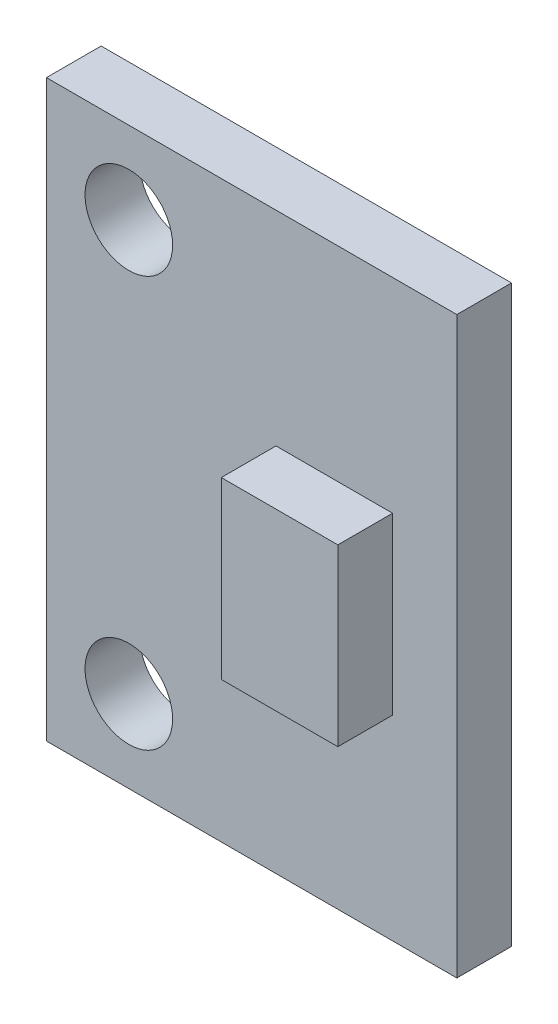
ISO-10303-21;
HEADER;
FILE_DESCRIPTION(('STEP AP214'),'2;1');
FILE_NAME('part.step','',(''),(''),'','','');
FILE_SCHEMA(('AUTOMOTIVE_DESIGN { 1 0 10303 214 1 1 1 1 }'));
ENDSEC;
DATA;
#1=APPLICATION_CONTEXT('core data for automotive mechanical design processes');
#2=APPLICATION_PROTOCOL_DEFINITION('international standard','automotive_design',2000,#1);
#3=PRODUCT_CONTEXT('',#1,'mechanical');
#4=PRODUCT('Part','Part','',(#3));
#5=PRODUCT_RELATED_PRODUCT_CATEGORY('part','',(#4));
#6=PRODUCT_DEFINITION_FORMATION('','',#4);
#7=PRODUCT_DEFINITION_CONTEXT('part definition',#1,'design');
#8=PRODUCT_DEFINITION('design','',#6,#7);
#9=PRODUCT_DEFINITION_SHAPE('','',#8);
#10=(LENGTH_UNIT() NAMED_UNIT(*) SI_UNIT(.MILLI.,.METRE.));
#11=(NAMED_UNIT(*) PLANE_ANGLE_UNIT() SI_UNIT($,.RADIAN.));
#12=(NAMED_UNIT(*) SI_UNIT($,.STERADIAN.) SOLID_ANGLE_UNIT());
#13=UNCERTAINTY_MEASURE_WITH_UNIT(LENGTH_MEASURE(1.E-05),#10,'distance_accuracy_value','');
#14=(GEOMETRIC_REPRESENTATION_CONTEXT(3) GLOBAL_UNCERTAINTY_ASSIGNED_CONTEXT((#13)) GLOBAL_UNIT_ASSIGNED_CONTEXT((#10,
#11,#12)) REPRESENTATION_CONTEXT('',''));
#15=CARTESIAN_POINT('',(0.,0.,0.));
#16=DIRECTION('',(0.,0.,1.));
#17=DIRECTION('',(1.,0.,0.));
#18=AXIS2_PLACEMENT_3D('',#15,#16,#17);
#19=CARTESIAN_POINT('',(0.,0.,2.));
#20=DIRECTION('',(0.,0.,1.));
#21=DIRECTION('',(1.,0.,0.));
#22=AXIS2_PLACEMENT_3D('',#19,#20,#21);
#23=PLANE('',#22);
#24=CARTESIAN_POINT('',(-81.438295893754,-171.388194030995,2.));
#25=DIRECTION('',(0.,0.,1.));
#26=DIRECTION('',(1.,0.,0.));
#27=AXIS2_PLACEMENT_3D('',#24,#25,#26);
#28=CIRCLE('',#27,1.6);
#29=CARTESIAN_POINT('',(-79.838295893754,-171.388194030995,2.));
#30=VERTEX_POINT('',#29);
#31=EDGE_CURVE('E147',#30,#30,#28,.T.);
#32=ORIENTED_EDGE('',*,*,#31,.F.);
#33=EDGE_LOOP('',(#32));
#34=FACE_BOUND('',#33,.T.);
#35=DIRECTION('',(0.,-1.,0.));
#36=VECTOR('',#35,1.);
#37=CARTESIAN_POINT('',(-84.4492861501245,-168.388194030995,2.));
#38=LINE('',#37,#36);
#39=CARTESIAN_POINT('',(-84.4492861501245,-168.388194030995,2.));
#40=VERTEX_POINT('',#39);
#41=CARTESIAN_POINT('',(-84.4492861501245,-189.388194030995,2.));
#42=VERTEX_POINT('',#41);
#43=EDGE_CURVE('E153',#40,#42,#38,.T.);
#44=ORIENTED_EDGE('',*,*,#43,.T.);
#45=DIRECTION('',(1.,0.,0.));
#46=VECTOR('',#45,1.);
#47=CARTESIAN_POINT('',(-84.4492861501245,-189.388194030995,2.));
#48=LINE('',#47,#46);
#49=CARTESIAN_POINT('',(-69.4492861501245,-189.388194030995,2.));
#50=VERTEX_POINT('',#49);
#51=EDGE_CURVE('E89',#42,#50,#48,.T.);
#52=ORIENTED_EDGE('',*,*,#51,.T.);
#53=DIRECTION('',(0.,1.,0.));
#54=VECTOR('',#53,1.);
#55=CARTESIAN_POINT('',(-69.4492861501245,-168.388194030995,2.));
#56=LINE('',#55,#54);
#57=CARTESIAN_POINT('',(-69.4492861501245,-168.388194030995,2.));
#58=VERTEX_POINT('',#57);
#59=EDGE_CURVE('E156',#50,#58,#56,.T.);
#60=ORIENTED_EDGE('',*,*,#59,.T.);
#61=DIRECTION('',(-1.,0.,0.));
#62=VECTOR('',#61,1.);
#63=CARTESIAN_POINT('',(-84.4492861501245,-168.388194030995,2.));
#64=LINE('',#63,#62);
#65=EDGE_CURVE('E61',#58,#40,#64,.T.);
#66=ORIENTED_EDGE('',*,*,#65,.T.);
#67=EDGE_LOOP('',(#44,#52,#60,#66));
#68=FACE_BOUND('',#67,.T.);
#69=CARTESIAN_POINT('',(-81.438295893754,-186.388194030995,2.));
#70=DIRECTION('',(0.,0.,1.));
#71=DIRECTION('',(1.,0.,0.));
#72=AXIS2_PLACEMENT_3D('',#69,#70,#71);
#73=CIRCLE('',#72,1.6);
#74=CARTESIAN_POINT('',(-79.838295893754,-186.388194030995,2.));
#75=VERTEX_POINT('',#74);
#76=EDGE_CURVE('E139',#75,#75,#73,.T.);
#77=ORIENTED_EDGE('',*,*,#76,.F.);
#78=EDGE_LOOP('',(#77));
#79=FACE_BOUND('',#78,.T.);
#80=DIRECTION('',(1.,0.,0.));
#81=VECTOR('',#80,1.);
#82=CARTESIAN_POINT('',(-76.0587653448197,-182.242282422918,2.));
#83=LINE('',#82,#81);
#84=CARTESIAN_POINT('',(-76.0587653448197,-182.242282422918,2.));
#85=VERTEX_POINT('',#84);
#86=CARTESIAN_POINT('',(-71.798583319056,-182.242282422918,2.));
#87=VERTEX_POINT('',#86);
#88=EDGE_CURVE('E302',#85,#87,#83,.T.);
#89=ORIENTED_EDGE('',*,*,#88,.F.);
#90=DIRECTION('',(0.,-1.,0.));
#91=VECTOR('',#90,1.);
#92=CARTESIAN_POINT('',(-76.0587653448197,-175.852009384272,2.));
#93=LINE('',#92,#91);
#94=CARTESIAN_POINT('',(-76.0587653448197,-175.852009384272,2.));
#95=VERTEX_POINT('',#94);
#96=EDGE_CURVE('E134',#95,#85,#93,.T.);
#97=ORIENTED_EDGE('',*,*,#96,.F.);
#98=DIRECTION('',(-1.,0.,0.));
#99=VECTOR('',#98,1.);
#100=CARTESIAN_POINT('',(-76.0587653448197,-175.852009384272,2.));
#101=LINE('',#100,#99);
#102=CARTESIAN_POINT('',(-71.798583319056,-175.852009384272,2.));
#103=VERTEX_POINT('',#102);
#104=EDGE_CURVE('E130',#103,#95,#101,.T.);
#105=ORIENTED_EDGE('',*,*,#104,.F.);
#106=DIRECTION('',(0.,1.,0.));
#107=VECTOR('',#106,1.);
#108=CARTESIAN_POINT('',(-71.798583319056,-175.852009384272,2.));
#109=LINE('',#108,#107);
#110=EDGE_CURVE('E299',#87,#103,#109,.T.);
#111=ORIENTED_EDGE('',*,*,#110,.F.);
#112=EDGE_LOOP('',(#89,#97,#105,#111));
#113=FACE_BOUND('',#112,.T.);
#114=ADVANCED_FACE('F37',(#34,#68,#79,#113),#23,.T.);
#115=CARTESIAN_POINT('',(0.,0.,0.));
#116=DIRECTION('',(0.,0.,1.));
#117=DIRECTION('',(1.,0.,0.));
#118=AXIS2_PLACEMENT_3D('',#115,#116,#117);
#119=PLANE('',#118);
#120=DIRECTION('',(0.,-1.,0.));
#121=VECTOR('',#120,1.);
#122=CARTESIAN_POINT('',(-84.4492861501245,-168.388194030995,0.));
#123=LINE('',#122,#121);
#124=CARTESIAN_POINT('',(-84.4492861501245,-168.388194030995,0.));
#125=VERTEX_POINT('',#124);
#126=CARTESIAN_POINT('',(-84.4492861501245,-189.388194030995,0.));
#127=VERTEX_POINT('',#126);
#128=EDGE_CURVE('E150',#125,#127,#123,.T.);
#129=ORIENTED_EDGE('',*,*,#128,.F.);
#130=DIRECTION('',(-1.,0.,0.));
#131=VECTOR('',#130,1.);
#132=CARTESIAN_POINT('',(-84.4492861501245,-168.388194030995,0.));
#133=LINE('',#132,#131);
#134=CARTESIAN_POINT('',(-69.4492861501245,-168.388194030995,0.));
#135=VERTEX_POINT('',#134);
#136=EDGE_CURVE('E82',#135,#125,#133,.T.);
#137=ORIENTED_EDGE('',*,*,#136,.F.);
#138=DIRECTION('',(0.,1.,0.));
#139=VECTOR('',#138,1.);
#140=CARTESIAN_POINT('',(-69.4492861501245,-168.388194030995,0.));
#141=LINE('',#140,#139);
#142=CARTESIAN_POINT('',(-69.4492861501245,-189.388194030995,0.));
#143=VERTEX_POINT('',#142);
#144=EDGE_CURVE('E164',#143,#135,#141,.T.);
#145=ORIENTED_EDGE('',*,*,#144,.F.);
#146=DIRECTION('',(1.,0.,0.));
#147=VECTOR('',#146,1.);
#148=CARTESIAN_POINT('',(-84.4492861501245,-189.388194030995,0.));
#149=LINE('',#148,#147);
#150=EDGE_CURVE('E162',#127,#143,#149,.T.);
#151=ORIENTED_EDGE('',*,*,#150,.F.);
#152=EDGE_LOOP('',(#129,#137,#145,#151));
#153=FACE_BOUND('',#152,.T.);
#154=CARTESIAN_POINT('',(-81.438295893754,-171.388194030995,0.));
#155=DIRECTION('',(0.,0.,1.));
#156=DIRECTION('',(1.,0.,0.));
#157=AXIS2_PLACEMENT_3D('',#154,#155,#156);
#158=CIRCLE('',#157,1.6);
#159=CARTESIAN_POINT('',(-79.838295893754,-171.388194030995,0.));
#160=VERTEX_POINT('',#159);
#161=EDGE_CURVE('E145',#160,#160,#158,.T.);
#162=ORIENTED_EDGE('',*,*,#161,.T.);
#163=EDGE_LOOP('',(#162));
#164=FACE_BOUND('',#163,.T.);
#165=CARTESIAN_POINT('',(-81.438295893754,-186.388194030995,0.));
#166=DIRECTION('',(0.,0.,1.));
#167=DIRECTION('',(1.,0.,0.));
#168=AXIS2_PLACEMENT_3D('',#165,#166,#167);
#169=CIRCLE('',#168,1.6);
#170=CARTESIAN_POINT('',(-79.838295893754,-186.388194030995,0.));
#171=VERTEX_POINT('',#170);
#172=EDGE_CURVE('E136',#171,#171,#169,.T.);
#173=ORIENTED_EDGE('',*,*,#172,.T.);
#174=EDGE_LOOP('',(#173));
#175=FACE_BOUND('',#174,.T.);
#176=ADVANCED_FACE('F177',(#153,#164,#175),#119,.F.);
#177=CARTESIAN_POINT('',(-84.4492861501245,-168.388194030995,2.));
#178=DIRECTION('',(1.,0.,0.));
#179=DIRECTION('',(0.,0.,-1.));
#180=AXIS2_PLACEMENT_3D('',#177,#178,#179);
#181=PLANE('',#180);
#182=ORIENTED_EDGE('',*,*,#128,.T.);
#183=DIRECTION('',(0.,0.,-1.));
#184=VECTOR('',#183,1.);
#185=CARTESIAN_POINT('',(-84.4492861501245,-189.388194030995,2.));
#186=LINE('',#185,#184);
#187=EDGE_CURVE('E11',#42,#127,#186,.T.);
#188=ORIENTED_EDGE('',*,*,#187,.F.);
#189=ORIENTED_EDGE('',*,*,#43,.F.);
#190=DIRECTION('',(0.,0.,-1.));
#191=VECTOR('',#190,1.);
#192=CARTESIAN_POINT('',(-84.4492861501245,-168.388194030995,2.));
#193=LINE('',#192,#191);
#194=EDGE_CURVE('E159',#40,#125,#193,.T.);
#195=ORIENTED_EDGE('',*,*,#194,.T.);
#196=EDGE_LOOP('',(#182,#188,#189,#195));
#197=FACE_BOUND('',#196,.T.);
#198=ADVANCED_FACE('F39',(#197),#181,.F.);
#199=CARTESIAN_POINT('',(-84.4492861501245,-189.388194030995,2.));
#200=DIRECTION('',(0.,1.,0.));
#201=DIRECTION('',(0.,0.,1.));
#202=AXIS2_PLACEMENT_3D('',#199,#200,#201);
#203=PLANE('',#202);
#204=ORIENTED_EDGE('',*,*,#150,.T.);
#205=DIRECTION('',(0.,0.,-1.));
#206=VECTOR('',#205,1.);
#207=CARTESIAN_POINT('',(-69.4492861501245,-189.388194030995,2.));
#208=LINE('',#207,#206);
#209=EDGE_CURVE('E45',#50,#143,#208,.T.);
#210=ORIENTED_EDGE('',*,*,#209,.F.);
#211=ORIENTED_EDGE('',*,*,#51,.F.);
#212=ORIENTED_EDGE('',*,*,#187,.T.);
#213=EDGE_LOOP('',(#204,#210,#211,#212));
#214=FACE_BOUND('',#213,.T.);
#215=ADVANCED_FACE('F193',(#214),#203,.F.);
#216=CARTESIAN_POINT('',(-69.4492861501245,-168.388194030995,2.));
#217=DIRECTION('',(-1.,0.,0.));
#218=DIRECTION('',(0.,0.,1.));
#219=AXIS2_PLACEMENT_3D('',#216,#217,#218);
#220=PLANE('',#219);
#221=ORIENTED_EDGE('',*,*,#144,.T.);
#222=DIRECTION('',(0.,0.,-1.));
#223=VECTOR('',#222,1.);
#224=CARTESIAN_POINT('',(-69.4492861501245,-168.388194030995,2.));
#225=LINE('',#224,#223);
#226=EDGE_CURVE('E168',#58,#135,#225,.T.);
#227=ORIENTED_EDGE('',*,*,#226,.F.);
#228=ORIENTED_EDGE('',*,*,#59,.F.);
#229=ORIENTED_EDGE('',*,*,#209,.T.);
#230=EDGE_LOOP('',(#221,#227,#228,#229));
#231=FACE_BOUND('',#230,.T.);
#232=ADVANCED_FACE('F173',(#231),#220,.F.);
#233=CARTESIAN_POINT('',(-84.4492861501245,-168.388194030995,2.));
#234=DIRECTION('',(0.,-1.,0.));
#235=DIRECTION('',(0.,0.,-1.));
#236=AXIS2_PLACEMENT_3D('',#233,#234,#235);
#237=PLANE('',#236);
#238=ORIENTED_EDGE('',*,*,#136,.T.);
#239=ORIENTED_EDGE('',*,*,#194,.F.);
#240=ORIENTED_EDGE('',*,*,#65,.F.);
#241=ORIENTED_EDGE('',*,*,#226,.T.);
#242=EDGE_LOOP('',(#238,#239,#240,#241));
#243=FACE_BOUND('',#242,.T.);
#244=ADVANCED_FACE('F182',(#243),#237,.F.);
#245=CARTESIAN_POINT('',(-81.438295893754,-171.388194030995,2.));
#246=DIRECTION('',(0.,0.,-1.));
#247=DIRECTION('',(-1.,0.,0.));
#248=AXIS2_PLACEMENT_3D('',#245,#246,#247);
#249=CYLINDRICAL_SURFACE('',#248,1.6);
#250=ORIENTED_EDGE('',*,*,#31,.T.);
#251=EDGE_LOOP('',(#250));
#252=FACE_BOUND('',#251,.T.);
#253=ORIENTED_EDGE('',*,*,#161,.F.);
#254=EDGE_LOOP('',(#253));
#255=FACE_BOUND('',#254,.T.);
#256=ADVANCED_FACE('F184',(#252,#255),#249,.F.);
#257=CARTESIAN_POINT('',(-81.438295893754,-186.388194030995,2.));
#258=DIRECTION('',(0.,0.,-1.));
#259=DIRECTION('',(-1.,0.,0.));
#260=AXIS2_PLACEMENT_3D('',#257,#258,#259);
#261=CYLINDRICAL_SURFACE('',#260,1.6);
#262=ORIENTED_EDGE('',*,*,#76,.T.);
#263=EDGE_LOOP('',(#262));
#264=FACE_BOUND('',#263,.T.);
#265=ORIENTED_EDGE('',*,*,#172,.F.);
#266=EDGE_LOOP('',(#265));
#267=FACE_BOUND('',#266,.T.);
#268=ADVANCED_FACE('F190',(#264,#267),#261,.F.);
#269=CARTESIAN_POINT('',(-76.0587653448197,-175.852009384272,4.));
#270=DIRECTION('',(1.,0.,0.));
#271=DIRECTION('',(0.,0.,-1.));
#272=AXIS2_PLACEMENT_3D('',#269,#270,#271);
#273=PLANE('',#272);
#274=ORIENTED_EDGE('',*,*,#96,.T.);
#275=DIRECTION('',(0.,0.,-1.));
#276=VECTOR('',#275,1.);
#277=CARTESIAN_POINT('',(-76.0587653448197,-182.242282422918,4.));
#278=LINE('',#277,#276);
#279=CARTESIAN_POINT('',(-76.0587653448197,-182.242282422918,4.));
#280=VERTEX_POINT('',#279);
#281=EDGE_CURVE('E115',#280,#85,#278,.T.);
#282=ORIENTED_EDGE('',*,*,#281,.F.);
#283=DIRECTION('',(0.,-1.,0.));
#284=VECTOR('',#283,1.);
#285=CARTESIAN_POINT('',(-76.0587653448197,-175.852009384272,4.));
#286=LINE('',#285,#284);
#287=CARTESIAN_POINT('',(-76.0587653448197,-175.852009384272,4.));
#288=VERTEX_POINT('',#287);
#289=EDGE_CURVE('E122',#288,#280,#286,.T.);
#290=ORIENTED_EDGE('',*,*,#289,.F.);
#291=DIRECTION('',(0.,0.,-1.));
#292=VECTOR('',#291,1.);
#293=CARTESIAN_POINT('',(-76.0587653448197,-175.852009384272,4.));
#294=LINE('',#293,#292);
#295=EDGE_CURVE('E296',#288,#95,#294,.T.);
#296=ORIENTED_EDGE('',*,*,#295,.T.);
#297=EDGE_LOOP('',(#274,#282,#290,#296));
#298=FACE_BOUND('',#297,.T.);
#299=ADVANCED_FACE('F132',(#298),#273,.F.);
#300=CARTESIAN_POINT('',(-76.0587653448197,-182.242282422918,4.));
#301=DIRECTION('',(0.,1.,0.));
#302=DIRECTION('',(0.,0.,1.));
#303=AXIS2_PLACEMENT_3D('',#300,#301,#302);
#304=PLANE('',#303);
#305=ORIENTED_EDGE('',*,*,#88,.T.);
#306=DIRECTION('',(0.,0.,-1.));
#307=VECTOR('',#306,1.);
#308=CARTESIAN_POINT('',(-71.798583319056,-182.242282422918,4.));
#309=LINE('',#308,#307);
#310=CARTESIAN_POINT('',(-71.798583319056,-182.242282422918,4.));
#311=VERTEX_POINT('',#310);
#312=EDGE_CURVE('E118',#311,#87,#309,.T.);
#313=ORIENTED_EDGE('',*,*,#312,.F.);
#314=DIRECTION('',(1.,0.,0.));
#315=VECTOR('',#314,1.);
#316=CARTESIAN_POINT('',(-76.0587653448197,-182.242282422918,4.));
#317=LINE('',#316,#315);
#318=EDGE_CURVE('E111',#280,#311,#317,.T.);
#319=ORIENTED_EDGE('',*,*,#318,.F.);
#320=ORIENTED_EDGE('',*,*,#281,.T.);
#321=EDGE_LOOP('',(#305,#313,#319,#320));
#322=FACE_BOUND('',#321,.T.);
#323=ADVANCED_FACE('F113',(#322),#304,.F.);
#324=CARTESIAN_POINT('',(-71.798583319056,-175.852009384272,4.));
#325=DIRECTION('',(-1.,0.,0.));
#326=DIRECTION('',(0.,0.,1.));
#327=AXIS2_PLACEMENT_3D('',#324,#325,#326);
#328=PLANE('',#327);
#329=ORIENTED_EDGE('',*,*,#110,.T.);
#330=DIRECTION('',(0.,0.,-1.));
#331=VECTOR('',#330,1.);
#332=CARTESIAN_POINT('',(-71.798583319056,-175.852009384272,4.));
#333=LINE('',#332,#331);
#334=CARTESIAN_POINT('',(-71.798583319056,-175.852009384272,4.));
#335=VERTEX_POINT('',#334);
#336=EDGE_CURVE('E52',#335,#103,#333,.T.);
#337=ORIENTED_EDGE('',*,*,#336,.F.);
#338=DIRECTION('',(0.,1.,0.));
#339=VECTOR('',#338,1.);
#340=CARTESIAN_POINT('',(-71.798583319056,-175.852009384272,4.));
#341=LINE('',#340,#339);
#342=EDGE_CURVE('E121',#311,#335,#341,.T.);
#343=ORIENTED_EDGE('',*,*,#342,.F.);
#344=ORIENTED_EDGE('',*,*,#312,.T.);
#345=EDGE_LOOP('',(#329,#337,#343,#344));
#346=FACE_BOUND('',#345,.T.);
#347=ADVANCED_FACE('F211',(#346),#328,.F.);
#348=CARTESIAN_POINT('',(-76.0587653448197,-175.852009384272,4.));
#349=DIRECTION('',(0.,-1.,0.));
#350=DIRECTION('',(0.,0.,-1.));
#351=AXIS2_PLACEMENT_3D('',#348,#349,#350);
#352=PLANE('',#351);
#353=ORIENTED_EDGE('',*,*,#104,.T.);
#354=ORIENTED_EDGE('',*,*,#295,.F.);
#355=DIRECTION('',(-1.,0.,0.));
#356=VECTOR('',#355,1.);
#357=CARTESIAN_POINT('',(-76.0587653448197,-175.852009384272,4.));
#358=LINE('',#357,#356);
#359=EDGE_CURVE('E126',#335,#288,#358,.T.);
#360=ORIENTED_EDGE('',*,*,#359,.F.);
#361=ORIENTED_EDGE('',*,*,#336,.T.);
#362=EDGE_LOOP('',(#353,#354,#360,#361));
#363=FACE_BOUND('',#362,.T.);
#364=ADVANCED_FACE('F214',(#363),#352,.F.);
#365=CARTESIAN_POINT('',(0.,0.,4.));
#366=DIRECTION('',(0.,0.,1.));
#367=DIRECTION('',(1.,0.,0.));
#368=AXIS2_PLACEMENT_3D('',#365,#366,#367);
#369=PLANE('',#368);
#370=ORIENTED_EDGE('',*,*,#289,.T.);
#371=ORIENTED_EDGE('',*,*,#318,.T.);
#372=ORIENTED_EDGE('',*,*,#342,.T.);
#373=ORIENTED_EDGE('',*,*,#359,.T.);
#374=EDGE_LOOP('',(#370,#371,#372,#373));
#375=FACE_BOUND('',#374,.T.);
#376=ADVANCED_FACE('F125',(#375),#369,.T.);
#377=CLOSED_SHELL('',(#114,#176,#198,#215,#232,#244,#256,#268,#299,#323,#347,#364,#376));
#378=MANIFOLD_SOLID_BREP('B2',#377);
#379=ADVANCED_BREP_SHAPE_REPRESENTATION('',(#18,#378),#14);
#380=SHAPE_DEFINITION_REPRESENTATION(#9,#379);
ENDSEC;
END-ISO-10303-21;
